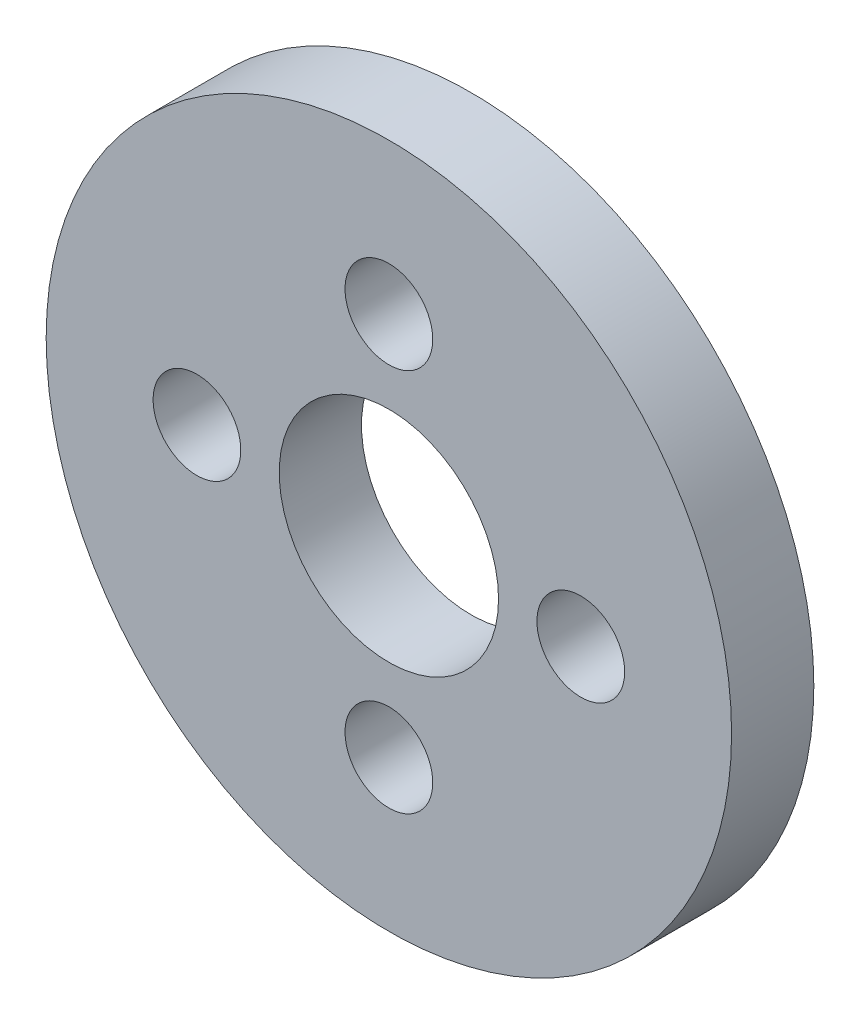
ISO-10303-21;
HEADER;
FILE_DESCRIPTION(('STEP AP214'),'2;1');
FILE_NAME('part.step','',(''),(''),'','','');
FILE_SCHEMA(('AUTOMOTIVE_DESIGN { 1 0 10303 214 1 1 1 1 }'));
ENDSEC;
DATA;
#1=APPLICATION_CONTEXT('core data for automotive mechanical design processes');
#2=APPLICATION_PROTOCOL_DEFINITION('international standard','automotive_design',2000,#1);
#3=PRODUCT_CONTEXT('',#1,'mechanical');
#4=PRODUCT('Part','Part','',(#3));
#5=PRODUCT_RELATED_PRODUCT_CATEGORY('part','',(#4));
#6=PRODUCT_DEFINITION_FORMATION('','',#4);
#7=PRODUCT_DEFINITION_CONTEXT('part definition',#1,'design');
#8=PRODUCT_DEFINITION('design','',#6,#7);
#9=PRODUCT_DEFINITION_SHAPE('','',#8);
#10=(LENGTH_UNIT() NAMED_UNIT(*) SI_UNIT(.MILLI.,.METRE.));
#11=(NAMED_UNIT(*) PLANE_ANGLE_UNIT() SI_UNIT($,.RADIAN.));
#12=(NAMED_UNIT(*) SI_UNIT($,.STERADIAN.) SOLID_ANGLE_UNIT());
#13=UNCERTAINTY_MEASURE_WITH_UNIT(LENGTH_MEASURE(1.E-05),#10,'distance_accuracy_value','');
#14=(GEOMETRIC_REPRESENTATION_CONTEXT(3) GLOBAL_UNCERTAINTY_ASSIGNED_CONTEXT((#13)) GLOBAL_UNIT_ASSIGNED_CONTEXT((#10,
#11,#12)) REPRESENTATION_CONTEXT('',''));
#15=CARTESIAN_POINT('',(0.,0.,0.));
#16=DIRECTION('',(0.,0.,1.));
#17=DIRECTION('',(1.,0.,0.));
#18=AXIS2_PLACEMENT_3D('',#15,#16,#17);
#19=CARTESIAN_POINT('',(0.,0.,3.));
#20=DIRECTION('',(0.,0.,1.));
#21=DIRECTION('',(1.,0.,0.));
#22=AXIS2_PLACEMENT_3D('',#19,#20,#21);
#23=PLANE('',#22);
#24=CARTESIAN_POINT('',(-7.,0.,3.));
#25=DIRECTION('',(0.,0.,1.));
#26=DIRECTION('',(-1.,0.,0.));
#27=AXIS2_PLACEMENT_3D('',#24,#25,#26);
#28=CIRCLE('',#27,1.6);
#29=CARTESIAN_POINT('',(-8.6,0.,3.));
#30=VERTEX_POINT('',#29);
#31=EDGE_CURVE('E61',#30,#30,#28,.T.);
#32=ORIENTED_EDGE('',*,*,#31,.F.);
#33=EDGE_LOOP('',(#32));
#34=FACE_BOUND('',#33,.T.);
#35=CARTESIAN_POINT('',(0.,7.,3.));
#36=DIRECTION('',(0.,0.,1.));
#37=DIRECTION('',(1.,0.,0.));
#38=AXIS2_PLACEMENT_3D('',#35,#36,#37);
#39=CIRCLE('',#38,1.6);
#40=CARTESIAN_POINT('',(1.6,7.,3.));
#41=VERTEX_POINT('',#40);
#42=EDGE_CURVE('E49',#41,#41,#39,.T.);
#43=ORIENTED_EDGE('',*,*,#42,.F.);
#44=EDGE_LOOP('',(#43));
#45=FACE_BOUND('',#44,.T.);
#46=CARTESIAN_POINT('',(0.,0.,3.));
#47=DIRECTION('',(0.,0.,1.));
#48=DIRECTION('',(1.,0.,0.));
#49=AXIS2_PLACEMENT_3D('',#46,#47,#48);
#50=CIRCLE('',#49,12.5);
#51=CARTESIAN_POINT('',(12.5,0.,3.));
#52=VERTEX_POINT('',#51);
#53=EDGE_CURVE('E10',#52,#52,#50,.T.);
#54=ORIENTED_EDGE('',*,*,#53,.T.);
#55=EDGE_LOOP('',(#54));
#56=FACE_BOUND('',#55,.T.);
#57=CARTESIAN_POINT('',(0.,0.,3.));
#58=DIRECTION('',(0.,0.,1.));
#59=DIRECTION('',(1.,0.,0.));
#60=AXIS2_PLACEMENT_3D('',#57,#58,#59);
#61=CIRCLE('',#60,4.);
#62=CARTESIAN_POINT('',(4.,0.,3.));
#63=VERTEX_POINT('',#62);
#64=EDGE_CURVE('E44',#63,#63,#61,.T.);
#65=ORIENTED_EDGE('',*,*,#64,.F.);
#66=EDGE_LOOP('',(#65));
#67=FACE_BOUND('',#66,.T.);
#68=CARTESIAN_POINT('',(7.,0.,3.));
#69=DIRECTION('',(0.,0.,1.));
#70=DIRECTION('',(1.,0.,0.));
#71=AXIS2_PLACEMENT_3D('',#68,#69,#70);
#72=CIRCLE('',#71,1.6);
#73=CARTESIAN_POINT('',(8.6,0.,3.));
#74=VERTEX_POINT('',#73);
#75=EDGE_CURVE('E55',#74,#74,#72,.T.);
#76=ORIENTED_EDGE('',*,*,#75,.F.);
#77=EDGE_LOOP('',(#76));
#78=FACE_BOUND('',#77,.T.);
#79=CARTESIAN_POINT('',(0.,-7.,3.));
#80=DIRECTION('',(0.,0.,1.));
#81=DIRECTION('',(-1.,0.,0.));
#82=AXIS2_PLACEMENT_3D('',#79,#80,#81);
#83=CIRCLE('',#82,1.6);
#84=CARTESIAN_POINT('',(-1.6,-7.,3.));
#85=VERTEX_POINT('',#84);
#86=EDGE_CURVE('E67',#85,#85,#83,.T.);
#87=ORIENTED_EDGE('',*,*,#86,.F.);
#88=EDGE_LOOP('',(#87));
#89=FACE_BOUND('',#88,.T.);
#90=ADVANCED_FACE('F33',(#34,#45,#56,#67,#78,#89),#23,.T.);
#91=CARTESIAN_POINT('',(0.,0.,0.));
#92=DIRECTION('',(0.,0.,1.));
#93=DIRECTION('',(1.,0.,0.));
#94=AXIS2_PLACEMENT_3D('',#91,#92,#93);
#95=PLANE('',#94);
#96=CARTESIAN_POINT('',(0.,0.,0.));
#97=DIRECTION('',(0.,0.,1.));
#98=DIRECTION('',(1.,0.,0.));
#99=AXIS2_PLACEMENT_3D('',#96,#97,#98);
#100=CIRCLE('',#99,12.5);
#101=CARTESIAN_POINT('',(12.5,0.,0.));
#102=VERTEX_POINT('',#101);
#103=EDGE_CURVE('E37',#102,#102,#100,.T.);
#104=ORIENTED_EDGE('',*,*,#103,.F.);
#105=EDGE_LOOP('',(#104));
#106=FACE_BOUND('',#105,.T.);
#107=CARTESIAN_POINT('',(0.,0.,0.));
#108=DIRECTION('',(0.,0.,1.));
#109=DIRECTION('',(1.,0.,0.));
#110=AXIS2_PLACEMENT_3D('',#107,#108,#109);
#111=CIRCLE('',#110,4.);
#112=CARTESIAN_POINT('',(4.,0.,0.));
#113=VERTEX_POINT('',#112);
#114=EDGE_CURVE('E46',#113,#113,#111,.T.);
#115=ORIENTED_EDGE('',*,*,#114,.T.);
#116=EDGE_LOOP('',(#115));
#117=FACE_BOUND('',#116,.T.);
#118=CARTESIAN_POINT('',(0.,7.,0.));
#119=DIRECTION('',(0.,0.,1.));
#120=DIRECTION('',(1.,0.,0.));
#121=AXIS2_PLACEMENT_3D('',#118,#119,#120);
#122=CIRCLE('',#121,1.6);
#123=CARTESIAN_POINT('',(1.6,7.,0.));
#124=VERTEX_POINT('',#123);
#125=EDGE_CURVE('E52',#124,#124,#122,.T.);
#126=ORIENTED_EDGE('',*,*,#125,.T.);
#127=EDGE_LOOP('',(#126));
#128=FACE_BOUND('',#127,.T.);
#129=CARTESIAN_POINT('',(7.,0.,0.));
#130=DIRECTION('',(0.,0.,1.));
#131=DIRECTION('',(1.,0.,0.));
#132=AXIS2_PLACEMENT_3D('',#129,#130,#131);
#133=CIRCLE('',#132,1.6);
#134=CARTESIAN_POINT('',(8.6,0.,0.));
#135=VERTEX_POINT('',#134);
#136=EDGE_CURVE('E58',#135,#135,#133,.T.);
#137=ORIENTED_EDGE('',*,*,#136,.T.);
#138=EDGE_LOOP('',(#137));
#139=FACE_BOUND('',#138,.T.);
#140=CARTESIAN_POINT('',(-7.,0.,0.));
#141=DIRECTION('',(0.,0.,1.));
#142=DIRECTION('',(-1.,0.,0.));
#143=AXIS2_PLACEMENT_3D('',#140,#141,#142);
#144=CIRCLE('',#143,1.6);
#145=CARTESIAN_POINT('',(-8.6,0.,0.));
#146=VERTEX_POINT('',#145);
#147=EDGE_CURVE('E64',#146,#146,#144,.T.);
#148=ORIENTED_EDGE('',*,*,#147,.T.);
#149=EDGE_LOOP('',(#148));
#150=FACE_BOUND('',#149,.T.);
#151=CARTESIAN_POINT('',(0.,-7.,0.));
#152=DIRECTION('',(0.,0.,1.));
#153=DIRECTION('',(-1.,0.,0.));
#154=AXIS2_PLACEMENT_3D('',#151,#152,#153);
#155=CIRCLE('',#154,1.6);
#156=CARTESIAN_POINT('',(-1.6,-7.,0.));
#157=VERTEX_POINT('',#156);
#158=EDGE_CURVE('E70',#157,#157,#155,.T.);
#159=ORIENTED_EDGE('',*,*,#158,.T.);
#160=EDGE_LOOP('',(#159));
#161=FACE_BOUND('',#160,.T.);
#162=ADVANCED_FACE('F80',(#106,#117,#128,#139,#150,#161),#95,.F.);
#163=CARTESIAN_POINT('',(0.,0.,3.));
#164=DIRECTION('',(0.,0.,-1.));
#165=DIRECTION('',(-1.,0.,0.));
#166=AXIS2_PLACEMENT_3D('',#163,#164,#165);
#167=CYLINDRICAL_SURFACE('',#166,12.5);
#168=ORIENTED_EDGE('',*,*,#53,.F.);
#169=EDGE_LOOP('',(#168));
#170=FACE_BOUND('',#169,.T.);
#171=ORIENTED_EDGE('',*,*,#103,.T.);
#172=EDGE_LOOP('',(#171));
#173=FACE_BOUND('',#172,.T.);
#174=ADVANCED_FACE('F35',(#170,#173),#167,.T.);
#175=CARTESIAN_POINT('',(0.,0.,3.));
#176=DIRECTION('',(0.,0.,-1.));
#177=DIRECTION('',(-1.,0.,0.));
#178=AXIS2_PLACEMENT_3D('',#175,#176,#177);
#179=CYLINDRICAL_SURFACE('',#178,4.);
#180=ORIENTED_EDGE('',*,*,#64,.T.);
#181=EDGE_LOOP('',(#180));
#182=FACE_BOUND('',#181,.T.);
#183=ORIENTED_EDGE('',*,*,#114,.F.);
#184=EDGE_LOOP('',(#183));
#185=FACE_BOUND('',#184,.T.);
#186=ADVANCED_FACE('F90',(#182,#185),#179,.F.);
#187=CARTESIAN_POINT('',(0.,7.,3.));
#188=DIRECTION('',(0.,0.,-1.));
#189=DIRECTION('',(-1.,0.,0.));
#190=AXIS2_PLACEMENT_3D('',#187,#188,#189);
#191=CYLINDRICAL_SURFACE('',#190,1.6);
#192=ORIENTED_EDGE('',*,*,#42,.T.);
#193=EDGE_LOOP('',(#192));
#194=FACE_BOUND('',#193,.T.);
#195=ORIENTED_EDGE('',*,*,#125,.F.);
#196=EDGE_LOOP('',(#195));
#197=FACE_BOUND('',#196,.T.);
#198=ADVANCED_FACE('F93',(#194,#197),#191,.F.);
#199=CARTESIAN_POINT('',(7.,0.,3.));
#200=DIRECTION('',(0.,0.,-1.));
#201=DIRECTION('',(-1.,0.,0.));
#202=AXIS2_PLACEMENT_3D('',#199,#200,#201);
#203=CYLINDRICAL_SURFACE('',#202,1.6);
#204=ORIENTED_EDGE('',*,*,#75,.T.);
#205=EDGE_LOOP('',(#204));
#206=FACE_BOUND('',#205,.T.);
#207=ORIENTED_EDGE('',*,*,#136,.F.);
#208=EDGE_LOOP('',(#207));
#209=FACE_BOUND('',#208,.T.);
#210=ADVANCED_FACE('F97',(#206,#209),#203,.F.);
#211=CARTESIAN_POINT('',(-7.,0.,3.));
#212=DIRECTION('',(0.,0.,-1.));
#213=DIRECTION('',(-1.,0.,0.));
#214=AXIS2_PLACEMENT_3D('',#211,#212,#213);
#215=CYLINDRICAL_SURFACE('',#214,1.6);
#216=ORIENTED_EDGE('',*,*,#31,.T.);
#217=EDGE_LOOP('',(#216));
#218=FACE_BOUND('',#217,.T.);
#219=ORIENTED_EDGE('',*,*,#147,.F.);
#220=EDGE_LOOP('',(#219));
#221=FACE_BOUND('',#220,.T.);
#222=ADVANCED_FACE('F101',(#218,#221),#215,.F.);
#223=CARTESIAN_POINT('',(0.,-7.,3.));
#224=DIRECTION('',(0.,0.,-1.));
#225=DIRECTION('',(-1.,0.,0.));
#226=AXIS2_PLACEMENT_3D('',#223,#224,#225);
#227=CYLINDRICAL_SURFACE('',#226,1.6);
#228=ORIENTED_EDGE('',*,*,#86,.T.);
#229=EDGE_LOOP('',(#228));
#230=FACE_BOUND('',#229,.T.);
#231=ORIENTED_EDGE('',*,*,#158,.F.);
#232=EDGE_LOOP('',(#231));
#233=FACE_BOUND('',#232,.T.);
#234=ADVANCED_FACE('F76',(#230,#233),#227,.F.);
#235=CLOSED_SHELL('',(#90,#162,#174,#186,#198,#210,#222,#234));
#236=MANIFOLD_SOLID_BREP('B2',#235);
#237=ADVANCED_BREP_SHAPE_REPRESENTATION('',(#18,#236),#14);
#238=SHAPE_DEFINITION_REPRESENTATION(#9,#237);
ENDSEC;
END-ISO-10303-21;
